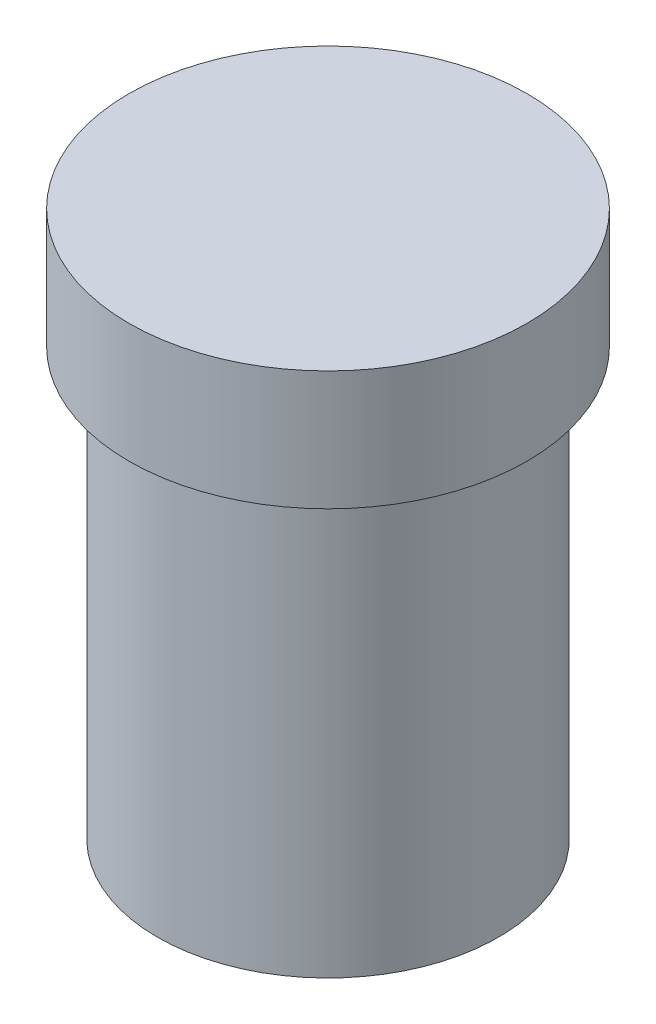
ISO-10303-21;
HEADER;
FILE_DESCRIPTION(('STEP AP214'),'2;1');
FILE_NAME('part.step','',(''),(''),'','','');
FILE_SCHEMA(('AUTOMOTIVE_DESIGN { 1 0 10303 214 1 1 1 1 }'));
ENDSEC;
DATA;
#1=APPLICATION_CONTEXT('core data for automotive mechanical design processes');
#2=APPLICATION_PROTOCOL_DEFINITION('international standard','automotive_design',2000,#1);
#3=PRODUCT_CONTEXT('',#1,'mechanical');
#4=PRODUCT('Part','Part','',(#3));
#5=PRODUCT_RELATED_PRODUCT_CATEGORY('part','',(#4));
#6=PRODUCT_DEFINITION_FORMATION('','',#4);
#7=PRODUCT_DEFINITION_CONTEXT('part definition',#1,'design');
#8=PRODUCT_DEFINITION('design','',#6,#7);
#9=PRODUCT_DEFINITION_SHAPE('','',#8);
#10=(LENGTH_UNIT() NAMED_UNIT(*) SI_UNIT(.MILLI.,.METRE.));
#11=(NAMED_UNIT(*) PLANE_ANGLE_UNIT() SI_UNIT($,.RADIAN.));
#12=(NAMED_UNIT(*) SI_UNIT($,.STERADIAN.) SOLID_ANGLE_UNIT());
#13=UNCERTAINTY_MEASURE_WITH_UNIT(LENGTH_MEASURE(1.E-05),#10,'distance_accuracy_value','');
#14=(GEOMETRIC_REPRESENTATION_CONTEXT(3) GLOBAL_UNCERTAINTY_ASSIGNED_CONTEXT((#13)) GLOBAL_UNIT_ASSIGNED_CONTEXT((#10,
#11,#12)) REPRESENTATION_CONTEXT('',''));
#15=CARTESIAN_POINT('',(0.,0.,0.));
#16=DIRECTION('',(0.,0.,1.));
#17=DIRECTION('',(1.,0.,0.));
#18=AXIS2_PLACEMENT_3D('',#15,#16,#17);
#19=CARTESIAN_POINT('',(0.,15.,0.));
#20=DIRECTION('',(0.,-1.,0.));
#21=DIRECTION('',(0.,0.,-1.));
#22=AXIS2_PLACEMENT_3D('',#19,#20,#21);
#23=CYLINDRICAL_SURFACE('',#22,6.);
#24=CARTESIAN_POINT('',(0.,15.,0.));
#25=DIRECTION('',(0.,1.,0.));
#26=DIRECTION('',(0.,0.,1.));
#27=AXIS2_PLACEMENT_3D('',#24,#25,#26);
#28=CIRCLE('',#27,6.);
#29=CARTESIAN_POINT('',(0.,15.,6.));
#30=VERTEX_POINT('',#29);
#31=EDGE_CURVE('E10',#30,#30,#28,.T.);
#32=ORIENTED_EDGE('',*,*,#31,.F.);
#33=EDGE_LOOP('',(#32));
#34=FACE_BOUND('',#33,.T.);
#35=CARTESIAN_POINT('',(0.,0.,0.));
#36=DIRECTION('',(0.,1.,0.));
#37=DIRECTION('',(0.,0.,1.));
#38=AXIS2_PLACEMENT_3D('',#35,#36,#37);
#39=CIRCLE('',#38,6.);
#40=CARTESIAN_POINT('',(0.,0.,6.));
#41=VERTEX_POINT('',#40);
#42=EDGE_CURVE('E34',#41,#41,#39,.T.);
#43=ORIENTED_EDGE('',*,*,#42,.T.);
#44=EDGE_LOOP('',(#43));
#45=FACE_BOUND('',#44,.T.);
#46=ADVANCED_FACE('F31',(#34,#45),#23,.T.);
#47=CARTESIAN_POINT('',(0.,0.,0.));
#48=DIRECTION('',(0.,1.,0.));
#49=DIRECTION('',(0.,0.,1.));
#50=AXIS2_PLACEMENT_3D('',#47,#48,#49);
#51=PLANE('',#50);
#52=ORIENTED_EDGE('',*,*,#42,.F.);
#53=EDGE_LOOP('',(#52));
#54=FACE_BOUND('',#53,.T.);
#55=ADVANCED_FACE('F54',(#54),#51,.F.);
#56=CARTESIAN_POINT('',(0.,19.2,0.));
#57=DIRECTION('',(0.,-1.,0.));
#58=DIRECTION('',(0.,0.,-1.));
#59=AXIS2_PLACEMENT_3D('',#56,#57,#58);
#60=CYLINDRICAL_SURFACE('',#59,7.);
#61=CARTESIAN_POINT('',(0.,19.2,0.));
#62=DIRECTION('',(0.,1.,0.));
#63=DIRECTION('',(0.,0.,1.));
#64=AXIS2_PLACEMENT_3D('',#61,#62,#63);
#65=CIRCLE('',#64,7.);
#66=CARTESIAN_POINT('',(0.,19.2,7.));
#67=VERTEX_POINT('',#66);
#68=EDGE_CURVE('E41',#67,#67,#65,.T.);
#69=ORIENTED_EDGE('',*,*,#68,.F.);
#70=EDGE_LOOP('',(#69));
#71=FACE_BOUND('',#70,.T.);
#72=CARTESIAN_POINT('',(0.,15.,0.));
#73=DIRECTION('',(0.,1.,0.));
#74=DIRECTION('',(0.,0.,1.));
#75=AXIS2_PLACEMENT_3D('',#72,#73,#74);
#76=CIRCLE('',#75,7.);
#77=CARTESIAN_POINT('',(0.,15.,7.));
#78=VERTEX_POINT('',#77);
#79=EDGE_CURVE('E43',#78,#78,#76,.T.);
#80=ORIENTED_EDGE('',*,*,#79,.T.);
#81=EDGE_LOOP('',(#80));
#82=FACE_BOUND('',#81,.T.);
#83=ADVANCED_FACE('F51',(#71,#82),#60,.T.);
#84=CARTESIAN_POINT('',(0.,19.2,0.));
#85=DIRECTION('',(0.,1.,0.));
#86=DIRECTION('',(0.,0.,1.));
#87=AXIS2_PLACEMENT_3D('',#84,#85,#86);
#88=PLANE('',#87);
#89=ORIENTED_EDGE('',*,*,#68,.T.);
#90=EDGE_LOOP('',(#89));
#91=FACE_BOUND('',#90,.T.);
#92=ADVANCED_FACE('F49',(#91),#88,.T.);
#93=CARTESIAN_POINT('',(0.,15.,0.));
#94=DIRECTION('',(0.,1.,0.));
#95=DIRECTION('',(0.,0.,1.));
#96=AXIS2_PLACEMENT_3D('',#93,#94,#95);
#97=PLANE('',#96);
#98=ORIENTED_EDGE('',*,*,#31,.T.);
#99=EDGE_LOOP('',(#98));
#100=FACE_BOUND('',#99,.T.);
#101=ORIENTED_EDGE('',*,*,#79,.F.);
#102=EDGE_LOOP('',(#101));
#103=FACE_BOUND('',#102,.T.);
#104=ADVANCED_FACE('F58',(#100,#103),#97,.F.);
#105=CLOSED_SHELL('',(#46,#55,#83,#92,#104));
#106=MANIFOLD_SOLID_BREP('B2',#105);
#107=ADVANCED_BREP_SHAPE_REPRESENTATION('',(#18,#106),#14);
#108=SHAPE_DEFINITION_REPRESENTATION(#9,#107);
ENDSEC;
END-ISO-10303-21;
